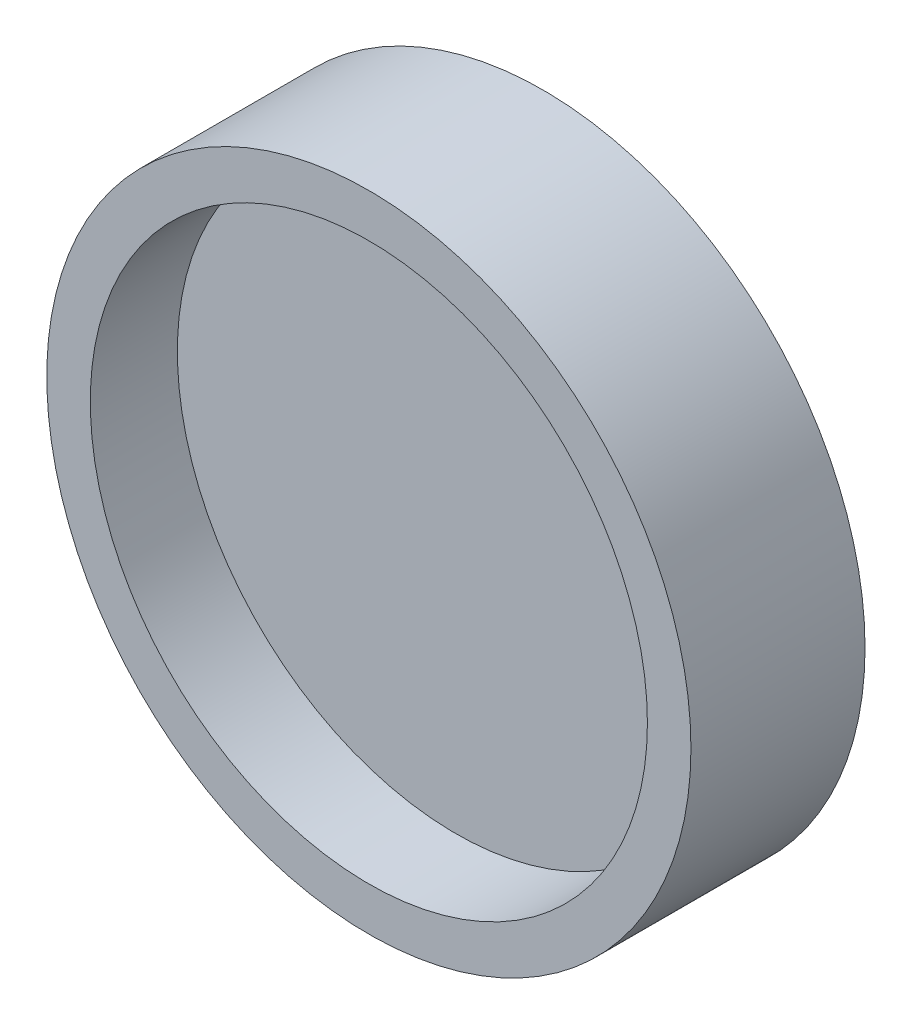
ISO-10303-21;
HEADER;
FILE_DESCRIPTION(('STEP AP214'),'2;1');
FILE_NAME('part.step','',(''),(''),'','','');
FILE_SCHEMA(('AUTOMOTIVE_DESIGN { 1 0 10303 214 1 1 1 1 }'));
ENDSEC;
DATA;
#1=APPLICATION_CONTEXT('core data for automotive mechanical design processes');
#2=APPLICATION_PROTOCOL_DEFINITION('international standard','automotive_design',2000,#1);
#3=PRODUCT_CONTEXT('',#1,'mechanical');
#4=PRODUCT('Part','Part','',(#3));
#5=PRODUCT_RELATED_PRODUCT_CATEGORY('part','',(#4));
#6=PRODUCT_DEFINITION_FORMATION('','',#4);
#7=PRODUCT_DEFINITION_CONTEXT('part definition',#1,'design');
#8=PRODUCT_DEFINITION('design','',#6,#7);
#9=PRODUCT_DEFINITION_SHAPE('','',#8);
#10=(LENGTH_UNIT() NAMED_UNIT(*) SI_UNIT(.MILLI.,.METRE.));
#11=(NAMED_UNIT(*) PLANE_ANGLE_UNIT() SI_UNIT($,.RADIAN.));
#12=(NAMED_UNIT(*) SI_UNIT($,.STERADIAN.) SOLID_ANGLE_UNIT());
#13=UNCERTAINTY_MEASURE_WITH_UNIT(LENGTH_MEASURE(1.E-05),#10,'distance_accuracy_value','');
#14=(GEOMETRIC_REPRESENTATION_CONTEXT(3) GLOBAL_UNCERTAINTY_ASSIGNED_CONTEXT((#13)) GLOBAL_UNIT_ASSIGNED_CONTEXT((#10,
#11,#12)) REPRESENTATION_CONTEXT('',''));
#15=CARTESIAN_POINT('',(0.,0.,0.));
#16=DIRECTION('',(0.,0.,1.));
#17=DIRECTION('',(1.,0.,0.));
#18=AXIS2_PLACEMENT_3D('',#15,#16,#17);
#19=CARTESIAN_POINT('',(0.,0.,40.));
#20=DIRECTION('',(0.,0.,-1.));
#21=DIRECTION('',(-1.,0.,0.));
#22=AXIS2_PLACEMENT_3D('',#19,#20,#21);
#23=CYLINDRICAL_SURFACE('',#22,74.);
#24=CARTESIAN_POINT('',(0.,0.,40.));
#25=DIRECTION('',(0.,0.,1.));
#26=DIRECTION('',(1.,0.,0.));
#27=AXIS2_PLACEMENT_3D('',#24,#25,#26);
#28=CIRCLE('',#27,74.);
#29=CARTESIAN_POINT('',(74.,0.,40.));
#30=VERTEX_POINT('',#29);
#31=EDGE_CURVE('E10',#30,#30,#28,.T.);
#32=ORIENTED_EDGE('',*,*,#31,.F.);
#33=EDGE_LOOP('',(#32));
#34=FACE_BOUND('',#33,.T.);
#35=CARTESIAN_POINT('',(0.,0.,0.));
#36=DIRECTION('',(0.,0.,1.));
#37=DIRECTION('',(1.,0.,0.));
#38=AXIS2_PLACEMENT_3D('',#35,#36,#37);
#39=CIRCLE('',#38,74.);
#40=CARTESIAN_POINT('',(74.,0.,0.));
#41=VERTEX_POINT('',#40);
#42=EDGE_CURVE('E34',#41,#41,#39,.T.);
#43=ORIENTED_EDGE('',*,*,#42,.T.);
#44=EDGE_LOOP('',(#43));
#45=FACE_BOUND('',#44,.T.);
#46=ADVANCED_FACE('F31',(#34,#45),#23,.T.);
#47=CARTESIAN_POINT('',(0.,0.,40.));
#48=DIRECTION('',(0.,0.,1.));
#49=DIRECTION('',(1.,0.,0.));
#50=AXIS2_PLACEMENT_3D('',#47,#48,#49);
#51=PLANE('',#50);
#52=CARTESIAN_POINT('',(0.,0.,40.));
#53=DIRECTION('',(0.,0.,1.));
#54=DIRECTION('',(1.,0.,0.));
#55=AXIS2_PLACEMENT_3D('',#52,#53,#54);
#56=CIRCLE('',#55,64.);
#57=CARTESIAN_POINT('',(64.,0.,40.));
#58=VERTEX_POINT('',#57);
#59=EDGE_CURVE('E43',#58,#58,#56,.T.);
#60=ORIENTED_EDGE('',*,*,#59,.F.);
#61=EDGE_LOOP('',(#60));
#62=FACE_BOUND('',#61,.T.);
#63=ORIENTED_EDGE('',*,*,#31,.T.);
#64=EDGE_LOOP('',(#63));
#65=FACE_BOUND('',#64,.T.);
#66=ADVANCED_FACE('F58',(#62,#65),#51,.T.);
#67=CARTESIAN_POINT('',(0.,0.,0.));
#68=DIRECTION('',(0.,0.,1.));
#69=DIRECTION('',(1.,0.,0.));
#70=AXIS2_PLACEMENT_3D('',#67,#68,#69);
#71=PLANE('',#70);
#72=ORIENTED_EDGE('',*,*,#42,.F.);
#73=EDGE_LOOP('',(#72));
#74=FACE_BOUND('',#73,.T.);
#75=ADVANCED_FACE('F54',(#74),#71,.F.);
#76=CARTESIAN_POINT('',(0.,0.,20.));
#77=DIRECTION('',(0.,0.,1.));
#78=DIRECTION('',(1.,0.,0.));
#79=AXIS2_PLACEMENT_3D('',#76,#77,#78);
#80=CYLINDRICAL_SURFACE('',#79,64.);
#81=CARTESIAN_POINT('',(0.,0.,20.));
#82=DIRECTION('',(0.,0.,1.));
#83=DIRECTION('',(1.,0.,0.));
#84=AXIS2_PLACEMENT_3D('',#81,#82,#83);
#85=CIRCLE('',#84,64.);
#86=CARTESIAN_POINT('',(64.,0.,20.));
#87=VERTEX_POINT('',#86);
#88=EDGE_CURVE('E41',#87,#87,#85,.T.);
#89=ORIENTED_EDGE('',*,*,#88,.F.);
#90=EDGE_LOOP('',(#89));
#91=FACE_BOUND('',#90,.T.);
#92=ORIENTED_EDGE('',*,*,#59,.T.);
#93=EDGE_LOOP('',(#92));
#94=FACE_BOUND('',#93,.T.);
#95=ADVANCED_FACE('F51',(#91,#94),#80,.F.);
#96=CARTESIAN_POINT('',(0.,0.,20.));
#97=DIRECTION('',(0.,0.,1.));
#98=DIRECTION('',(1.,0.,0.));
#99=AXIS2_PLACEMENT_3D('',#96,#97,#98);
#100=PLANE('',#99);
#101=ORIENTED_EDGE('',*,*,#88,.T.);
#102=EDGE_LOOP('',(#101));
#103=FACE_BOUND('',#102,.T.);
#104=ADVANCED_FACE('F49',(#103),#100,.T.);
#105=CLOSED_SHELL('',(#46,#66,#75,#95,#104));
#106=MANIFOLD_SOLID_BREP('B2',#105);
#107=ADVANCED_BREP_SHAPE_REPRESENTATION('',(#18,#106),#14);
#108=SHAPE_DEFINITION_REPRESENTATION(#9,#107);
ENDSEC;
END-ISO-10303-21;
